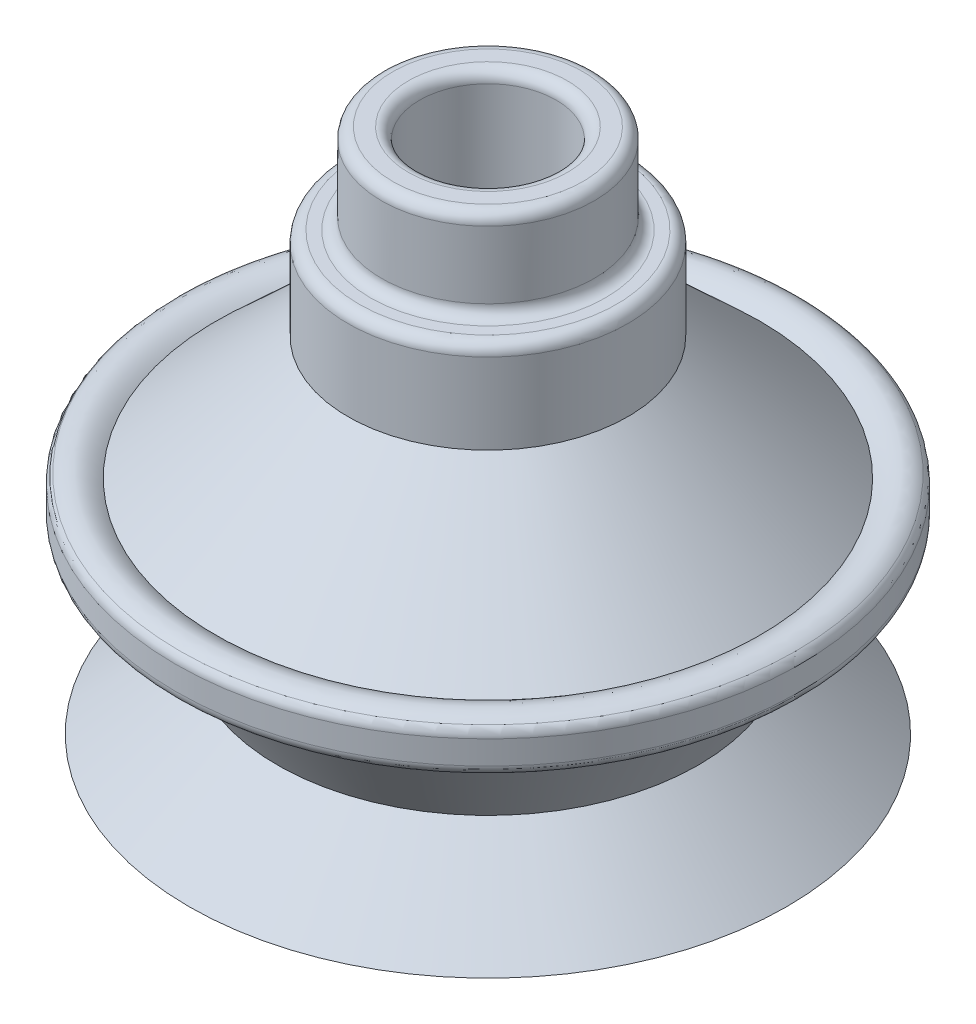
ISO-10303-21;
HEADER;
FILE_DESCRIPTION(('STEP AP214'),'2;1');
FILE_NAME('part.step','',(''),(''),'','','');
FILE_SCHEMA(('AUTOMOTIVE_DESIGN { 1 0 10303 214 1 1 1 1 }'));
ENDSEC;
DATA;
#1=APPLICATION_CONTEXT('core data for automotive mechanical design processes');
#2=APPLICATION_PROTOCOL_DEFINITION('international standard','automotive_design',2000,#1);
#3=PRODUCT_CONTEXT('',#1,'mechanical');
#4=PRODUCT('Part','Part','',(#3));
#5=PRODUCT_RELATED_PRODUCT_CATEGORY('part','',(#4));
#6=PRODUCT_DEFINITION_FORMATION('','',#4);
#7=PRODUCT_DEFINITION_CONTEXT('part definition',#1,'design');
#8=PRODUCT_DEFINITION('design','',#6,#7);
#9=PRODUCT_DEFINITION_SHAPE('','',#8);
#10=(LENGTH_UNIT() NAMED_UNIT(*) SI_UNIT(.MILLI.,.METRE.));
#11=(NAMED_UNIT(*) PLANE_ANGLE_UNIT() SI_UNIT($,.RADIAN.));
#12=(NAMED_UNIT(*) SI_UNIT($,.STERADIAN.) SOLID_ANGLE_UNIT());
#13=UNCERTAINTY_MEASURE_WITH_UNIT(LENGTH_MEASURE(1.E-05),#10,'distance_accuracy_value','');
#14=(GEOMETRIC_REPRESENTATION_CONTEXT(3) GLOBAL_UNCERTAINTY_ASSIGNED_CONTEXT((#13)) GLOBAL_UNIT_ASSIGNED_CONTEXT((#10,
#11,#12)) REPRESENTATION_CONTEXT('',''));
#15=CARTESIAN_POINT('',(0.,0.,0.));
#16=DIRECTION('',(0.,0.,1.));
#17=DIRECTION('',(1.,0.,0.));
#18=AXIS2_PLACEMENT_3D('',#15,#16,#17);
#19=CARTESIAN_POINT('',(11.15,-11.4805204985761,0.));
#20=DIRECTION('',(0.,1.,0.));
#21=DIRECTION('',(-1.,0.,0.));
#22=AXIS2_PLACEMENT_3D('',#19,#20,#21);
#23=PLANE('',#22);
#24=CARTESIAN_POINT('',(0.,-11.480520498576,0.));
#25=DIRECTION('',(0.,-1.,0.));
#26=DIRECTION('',(1.,0.,0.));
#27=AXIS2_PLACEMENT_3D('',#24,#25,#26);
#28=CIRCLE('',#27,11.15);
#29=CARTESIAN_POINT('',(11.15,-11.4805204985761,0.));
#30=VERTEX_POINT('',#29);
#31=EDGE_CURVE('E58',#30,#30,#28,.T.);
#32=ORIENTED_EDGE('',*,*,#31,.T.);
#33=EDGE_LOOP('',(#32));
#34=FACE_BOUND('',#33,.T.);
#35=CARTESIAN_POINT('',(0.,-11.480520498576,0.));
#36=DIRECTION('',(0.,-1.,0.));
#37=DIRECTION('',(1.,0.,0.));
#38=AXIS2_PLACEMENT_3D('',#35,#36,#37);
#39=CIRCLE('',#38,12.2427575);
#40=CARTESIAN_POINT('',(12.2427575,-11.4805204985761,0.));
#41=VERTEX_POINT('',#40);
#42=EDGE_CURVE('E11',#41,#41,#39,.T.);
#43=ORIENTED_EDGE('',*,*,#42,.F.);
#44=EDGE_LOOP('',(#43));
#45=FACE_BOUND('',#44,.T.);
#46=ADVANCED_FACE('F48',(#34,#45),#23,.T.);
#47=CARTESIAN_POINT('',(0.,-16.,0.));
#48=DIRECTION('',(0.,1.,0.));
#49=DIRECTION('',(-1.,0.,0.));
#50=AXIS2_PLACEMENT_3D('',#47,#48,#49);
#51=CONICAL_SURFACE('',#50,9.40000000000002,0.561471325993004);
#52=ORIENTED_EDGE('',*,*,#42,.T.);
#53=EDGE_LOOP('',(#52));
#54=FACE_BOUND('',#53,.T.);
#55=CARTESIAN_POINT('',(0.,-16.,0.));
#56=DIRECTION('',(0.,-1.,0.));
#57=DIRECTION('',(1.,0.,0.));
#58=AXIS2_PLACEMENT_3D('',#55,#56,#57);
#59=CIRCLE('',#58,9.40000000000002);
#60=CARTESIAN_POINT('',(9.4,-16.,0.));
#61=VERTEX_POINT('',#60);
#62=EDGE_CURVE('E54',#61,#61,#59,.T.);
#63=ORIENTED_EDGE('',*,*,#62,.F.);
#64=EDGE_LOOP('',(#63));
#65=FACE_BOUND('',#64,.T.);
#66=ADVANCED_FACE('F91',(#54,#65),#51,.T.);
#67=CARTESIAN_POINT('',(0.,-11.480520498576,0.));
#68=DIRECTION('',(0.,1.,0.));
#69=DIRECTION('',(-1.,0.,0.));
#70=AXIS2_PLACEMENT_3D('',#67,#68,#69);
#71=CONICAL_SURFACE('',#70,11.15,0.425837064198457);
#72=CARTESIAN_POINT('',(0.,-16.,0.));
#73=DIRECTION('',(0.,1.,0.));
#74=DIRECTION('',(0.,0.,1.));
#75=AXIS2_PLACEMENT_3D('',#72,#73,#74);
#76=CIRCLE('',#75,9.1);
#77=CARTESIAN_POINT('',(0.,-16.,9.1));
#78=VERTEX_POINT('',#77);
#79=EDGE_CURVE('E62',#78,#78,#76,.T.);
#80=ORIENTED_EDGE('',*,*,#79,.F.);
#81=EDGE_LOOP('',(#80));
#82=FACE_BOUND('',#81,.T.);
#83=ORIENTED_EDGE('',*,*,#31,.F.);
#84=EDGE_LOOP('',(#83));
#85=FACE_BOUND('',#84,.T.);
#86=ADVANCED_FACE('F85',(#82,#85),#71,.F.);
#87=CARTESIAN_POINT('',(0.,-16.,0.));
#88=DIRECTION('',(0.,-1.,0.));
#89=DIRECTION('',(0.,0.,-1.));
#90=AXIS2_PLACEMENT_3D('',#87,#88,#89);
#91=CONICAL_SURFACE('',#90,9.1,0.806374107431471);
#92=CARTESIAN_POINT('',(0.,-19.5,0.));
#93=DIRECTION('',(0.,1.,0.));
#94=DIRECTION('',(0.,0.,1.));
#95=AXIS2_PLACEMENT_3D('',#92,#93,#94);
#96=CIRCLE('',#95,12.75);
#97=CARTESIAN_POINT('',(0.,-19.5,12.75));
#98=VERTEX_POINT('',#97);
#99=EDGE_CURVE('E67',#98,#98,#96,.T.);
#100=ORIENTED_EDGE('',*,*,#99,.F.);
#101=EDGE_LOOP('',(#100));
#102=FACE_BOUND('',#101,.T.);
#103=ORIENTED_EDGE('',*,*,#79,.T.);
#104=EDGE_LOOP('',(#103));
#105=FACE_BOUND('',#104,.T.);
#106=ADVANCED_FACE('F79',(#102,#105),#91,.F.);
#107=CARTESIAN_POINT('',(12.75,-19.5,0.));
#108=DIRECTION('',(0.,1.,0.));
#109=DIRECTION('',(0.,0.,1.));
#110=AXIS2_PLACEMENT_3D('',#107,#108,#109);
#111=PLANE('',#110);
#112=CARTESIAN_POINT('',(0.,-19.5,0.));
#113=DIRECTION('',(0.,1.,0.));
#114=DIRECTION('',(0.,0.,1.));
#115=AXIS2_PLACEMENT_3D('',#112,#113,#114);
#116=CIRCLE('',#115,13.35);
#117=CARTESIAN_POINT('',(0.,-19.5,13.35));
#118=VERTEX_POINT('',#117);
#119=EDGE_CURVE('E70',#118,#118,#116,.T.);
#120=ORIENTED_EDGE('',*,*,#119,.F.);
#121=EDGE_LOOP('',(#120));
#122=FACE_BOUND('',#121,.T.);
#123=ORIENTED_EDGE('',*,*,#99,.T.);
#124=EDGE_LOOP('',(#123));
#125=FACE_BOUND('',#124,.T.);
#126=ADVANCED_FACE('F76',(#122,#125),#111,.F.);
#127=CARTESIAN_POINT('',(0.,-19.5,0.));
#128=DIRECTION('',(0.,-1.,0.));
#129=DIRECTION('',(0.,0.,-1.));
#130=AXIS2_PLACEMENT_3D('',#127,#128,#129);
#131=CONICAL_SURFACE('',#130,13.35,0.845727548937141);
#132=ORIENTED_EDGE('',*,*,#62,.T.);
#133=EDGE_LOOP('',(#132));
#134=FACE_BOUND('',#133,.T.);
#135=ORIENTED_EDGE('',*,*,#119,.T.);
#136=EDGE_LOOP('',(#135));
#137=FACE_BOUND('',#136,.T.);
#138=ADVANCED_FACE('F74',(#134,#137),#131,.T.);
#139=CLOSED_SHELL('',(#46,#66,#86,#106,#126,#138));
#140=MANIFOLD_SOLID_BREP('B2',#139);
#141=CARTESIAN_POINT('',(0.,4.,0.));
#142=DIRECTION('',(0.,1.,0.));
#143=DIRECTION('',(0.,0.,1.));
#144=AXIS2_PLACEMENT_3D('',#141,#142,#143);
#145=PLANE('',#144);
#146=CARTESIAN_POINT('',(0.,4.,0.));
#147=DIRECTION('',(0.,1.,0.));
#148=DIRECTION('',(0.,0.,1.));
#149=AXIS2_PLACEMENT_3D('',#146,#147,#148);
#150=CIRCLE('',#149,3.55);
#151=CARTESIAN_POINT('',(0.,4.,3.55));
#152=VERTEX_POINT('',#151);
#153=EDGE_CURVE('E175',#152,#152,#150,.F.);
#154=ORIENTED_EDGE('',*,*,#153,.T.);
#155=EDGE_LOOP('',(#154));
#156=FACE_BOUND('',#155,.T.);
#157=CARTESIAN_POINT('',(0.,4.,0.));
#158=DIRECTION('',(0.,1.,0.));
#159=DIRECTION('',(0.,0.,1.));
#160=AXIS2_PLACEMENT_3D('',#157,#158,#159);
#161=CIRCLE('',#160,4.25);
#162=CARTESIAN_POINT('',(0.,4.,4.25));
#163=VERTEX_POINT('',#162);
#164=EDGE_CURVE('E179',#163,#163,#161,.T.);
#165=ORIENTED_EDGE('',*,*,#164,.T.);
#166=EDGE_LOOP('',(#165));
#167=FACE_BOUND('',#166,.T.);
#168=ADVANCED_FACE('F151',(#156,#167),#145,.T.);
#169=CARTESIAN_POINT('',(0.,4.,0.));
#170=DIRECTION('',(0.,-1.,0.));
#171=DIRECTION('',(0.,0.,-1.));
#172=AXIS2_PLACEMENT_3D('',#169,#170,#171);
#173=CYLINDRICAL_SURFACE('',#172,4.75);
#174=CARTESIAN_POINT('',(0.,0.5,0.));
#175=DIRECTION('',(0.,-1.,0.));
#176=DIRECTION('',(0.,0.,-1.));
#177=AXIS2_PLACEMENT_3D('',#174,#175,#176);
#178=CIRCLE('',#177,4.75);
#179=CARTESIAN_POINT('',(0.,0.5,-4.75));
#180=VERTEX_POINT('',#179);
#181=EDGE_CURVE('E187',#180,#180,#178,.F.);
#182=ORIENTED_EDGE('',*,*,#181,.T.);
#183=EDGE_LOOP('',(#182));
#184=FACE_BOUND('',#183,.T.);
#185=CARTESIAN_POINT('',(0.,3.5,0.));
#186=DIRECTION('',(0.,1.,0.));
#187=DIRECTION('',(0.,0.,1.));
#188=AXIS2_PLACEMENT_3D('',#185,#186,#187);
#189=CIRCLE('',#188,4.75);
#190=CARTESIAN_POINT('',(0.,3.5,4.75));
#191=VERTEX_POINT('',#190);
#192=EDGE_CURVE('E191',#191,#191,#189,.F.);
#193=ORIENTED_EDGE('',*,*,#192,.T.);
#194=EDGE_LOOP('',(#193));
#195=FACE_BOUND('',#194,.T.);
#196=ADVANCED_FACE('F280',(#184,#195),#173,.T.);
#197=CARTESIAN_POINT('',(0.,4.,0.));
#198=DIRECTION('',(0.,-1.,0.));
#199=DIRECTION('',(0.,0.,-1.));
#200=AXIS2_PLACEMENT_3D('',#197,#198,#199);
#201=CYLINDRICAL_SURFACE('',#200,3.05);
#202=CARTESIAN_POINT('',(0.,3.5,0.));
#203=DIRECTION('',(0.,1.,0.));
#204=DIRECTION('',(0.,0.,1.));
#205=AXIS2_PLACEMENT_3D('',#202,#203,#204);
#206=CIRCLE('',#205,3.05);
#207=CARTESIAN_POINT('',(0.,3.5,3.05));
#208=VERTEX_POINT('',#207);
#209=EDGE_CURVE('E183',#208,#208,#206,.T.);
#210=ORIENTED_EDGE('',*,*,#209,.T.);
#211=EDGE_LOOP('',(#210));
#212=FACE_BOUND('',#211,.T.);
#213=CARTESIAN_POINT('',(0.,-4.1,0.));
#214=DIRECTION('',(0.,-1.,0.));
#215=DIRECTION('',(0.,0.,-1.));
#216=AXIS2_PLACEMENT_3D('',#213,#214,#215);
#217=CIRCLE('',#216,3.05);
#218=CARTESIAN_POINT('',(0.,-4.1,-3.05));
#219=VERTEX_POINT('',#218);
#220=EDGE_CURVE('E215',#219,#219,#217,.T.);
#221=ORIENTED_EDGE('',*,*,#220,.T.);
#222=EDGE_LOOP('',(#221));
#223=FACE_BOUND('',#222,.T.);
#224=ADVANCED_FACE('F273',(#212,#223),#201,.F.);
#225=CARTESIAN_POINT('',(0.,0.,0.));
#226=DIRECTION('',(0.,-1.,0.));
#227=DIRECTION('',(0.,0.,-1.));
#228=AXIS2_PLACEMENT_3D('',#225,#226,#227);
#229=PLANE('',#228);
#230=CARTESIAN_POINT('',(0.,0.,0.));
#231=DIRECTION('',(0.,-1.,0.));
#232=DIRECTION('',(0.,0.,-1.));
#233=AXIS2_PLACEMENT_3D('',#230,#231,#232);
#234=CIRCLE('',#233,5.75);
#235=CARTESIAN_POINT('',(0.,0.,-5.75));
#236=VERTEX_POINT('',#235);
#237=EDGE_CURVE('E195',#236,#236,#234,.F.);
#238=ORIENTED_EDGE('',*,*,#237,.T.);
#239=EDGE_LOOP('',(#238));
#240=FACE_BOUND('',#239,.T.);
#241=CARTESIAN_POINT('',(0.,0.,0.));
#242=DIRECTION('',(0.,-1.,0.));
#243=DIRECTION('',(0.,0.,-1.));
#244=AXIS2_PLACEMENT_3D('',#241,#242,#243);
#245=CIRCLE('',#244,5.25);
#246=CARTESIAN_POINT('',(0.,0.,-5.25));
#247=VERTEX_POINT('',#246);
#248=EDGE_CURVE('E199',#247,#247,#245,.T.);
#249=ORIENTED_EDGE('',*,*,#248,.T.);
#250=EDGE_LOOP('',(#249));
#251=FACE_BOUND('',#250,.T.);
#252=ADVANCED_FACE('F270',(#240,#251),#229,.F.);
#253=CARTESIAN_POINT('',(0.,-4.1,0.));
#254=DIRECTION('',(0.,1.,0.));
#255=DIRECTION('',(0.,0.,1.));
#256=AXIS2_PLACEMENT_3D('',#253,#254,#255);
#257=CYLINDRICAL_SURFACE('',#256,6.25);
#258=CARTESIAN_POINT('',(0.,-0.5,0.));
#259=DIRECTION('',(0.,-1.,0.));
#260=DIRECTION('',(0.,0.,-1.));
#261=AXIS2_PLACEMENT_3D('',#258,#259,#260);
#262=CIRCLE('',#261,6.25);
#263=CARTESIAN_POINT('',(0.,-0.5,-6.25));
#264=VERTEX_POINT('',#263);
#265=EDGE_CURVE('E203',#264,#264,#262,.T.);
#266=ORIENTED_EDGE('',*,*,#265,.T.);
#267=EDGE_LOOP('',(#266));
#268=FACE_BOUND('',#267,.T.);
#269=CARTESIAN_POINT('',(0.,-4.1,0.));
#270=DIRECTION('',(0.,-1.,0.));
#271=DIRECTION('',(0.,0.,-1.));
#272=AXIS2_PLACEMENT_3D('',#269,#270,#271);
#273=CIRCLE('',#272,6.25);
#274=CARTESIAN_POINT('',(0.,-4.1,-6.25));
#275=VERTEX_POINT('',#274);
#276=EDGE_CURVE('E207',#275,#275,#273,.T.);
#277=ORIENTED_EDGE('',*,*,#276,.F.);
#278=EDGE_LOOP('',(#277));
#279=FACE_BOUND('',#278,.T.);
#280=ADVANCED_FACE('F268',(#268,#279),#257,.T.);
#281=CARTESIAN_POINT('',(0.,-9.6,0.));
#282=DIRECTION('',(0.,-1.,0.));
#283=DIRECTION('',(0.,0.,-1.));
#284=AXIS2_PLACEMENT_3D('',#281,#282,#283);
#285=CONICAL_SURFACE('',#284,12.15,0.820471493930674);
#286=ORIENTED_EDGE('',*,*,#276,.T.);
#287=EDGE_LOOP('',(#286));
#288=FACE_BOUND('',#287,.T.);
#289=CARTESIAN_POINT('',(0.,-9.6,0.));
#290=DIRECTION('',(0.,-1.,0.));
#291=DIRECTION('',(0.,0.,-1.));
#292=AXIS2_PLACEMENT_3D('',#289,#290,#291);
#293=CIRCLE('',#292,12.15);
#294=CARTESIAN_POINT('',(0.,-9.6,-12.15));
#295=VERTEX_POINT('',#294);
#296=EDGE_CURVE('E211',#295,#295,#293,.T.);
#297=ORIENTED_EDGE('',*,*,#296,.F.);
#298=EDGE_LOOP('',(#297));
#299=FACE_BOUND('',#298,.T.);
#300=ADVANCED_FACE('F264',(#288,#299),#285,.T.);
#301=CARTESIAN_POINT('',(0.,-4.1,0.));
#302=DIRECTION('',(0.,-1.,0.));
#303=DIRECTION('',(0.,0.,-1.));
#304=AXIS2_PLACEMENT_3D('',#301,#302,#303);
#305=CONICAL_SURFACE('',#304,3.05,0.974295344275071);
#306=CARTESIAN_POINT('',(0.,-9.6,0.));
#307=DIRECTION('',(0.,-1.,0.));
#308=DIRECTION('',(0.,0.,-1.));
#309=AXIS2_PLACEMENT_3D('',#306,#307,#308);
#310=CIRCLE('',#309,11.15);
#311=CARTESIAN_POINT('',(0.,-9.6,-11.15));
#312=VERTEX_POINT('',#311);
#313=EDGE_CURVE('E219',#312,#312,#310,.T.);
#314=CARTESIAN_POINT('',(0.,-9.6,-11.15));
#315=CARTESIAN_POINT('',(0.,-9.54270833333333,-11.065625));
#316=CARTESIAN_POINT('',(0.,-9.48541666666667,-10.98125));
#317=CARTESIAN_POINT('',(0.,-9.37083333333333,-10.8125));
#318=CARTESIAN_POINT('',(0.,-9.31354166666667,-10.728125));
#319=CARTESIAN_POINT('',(0.,-9.19895833333333,-10.559375));
#320=CARTESIAN_POINT('',(0.,-9.14166666666666,-10.475));
#321=CARTESIAN_POINT('',(0.,-9.02708333333333,-10.30625));
#322=CARTESIAN_POINT('',(0.,-8.96979166666667,-10.221875));
#323=CARTESIAN_POINT('',(0.,-8.85520833333333,-10.053125));
#324=CARTESIAN_POINT('',(0.,-8.79791666666667,-9.96875));
#325=CARTESIAN_POINT('',(0.,-8.68333333333333,-9.8));
#326=CARTESIAN_POINT('',(0.,-8.62604166666667,-9.715625));
#327=CARTESIAN_POINT('',(0.,-8.51145833333333,-9.546875));
#328=CARTESIAN_POINT('',(0.,-8.45416666666667,-9.4625));
#329=CARTESIAN_POINT('',(0.,-8.33958333333333,-9.29375));
#330=CARTESIAN_POINT('',(0.,-8.28229166666667,-9.209375));
#331=CARTESIAN_POINT('',(0.,-8.16770833333333,-9.040625));
#332=CARTESIAN_POINT('',(0.,-8.11041666666667,-8.95625));
#333=CARTESIAN_POINT('',(0.,-7.99583333333333,-8.7875));
#334=CARTESIAN_POINT('',(0.,-7.93854166666667,-8.703125));
#335=CARTESIAN_POINT('',(0.,-7.82395833333333,-8.534375));
#336=CARTESIAN_POINT('',(0.,-7.76666666666667,-8.45));
#337=CARTESIAN_POINT('',(0.,-7.65208333333333,-8.28125));
#338=CARTESIAN_POINT('',(0.,-7.59479166666667,-8.196875));
#339=CARTESIAN_POINT('',(0.,-7.48020833333333,-8.028125));
#340=CARTESIAN_POINT('',(0.,-7.42291666666667,-7.94375));
#341=CARTESIAN_POINT('',(0.,-7.30833333333333,-7.775));
#342=CARTESIAN_POINT('',(0.,-7.25104166666666,-7.690625));
#343=CARTESIAN_POINT('',(0.,-7.13645833333333,-7.521875));
#344=CARTESIAN_POINT('',(0.,-7.07916666666666,-7.4375));
#345=CARTESIAN_POINT('',(0.,-6.96458333333333,-7.26875));
#346=CARTESIAN_POINT('',(0.,-6.90729166666666,-7.184375));
#347=CARTESIAN_POINT('',(0.,-6.79270833333333,-7.015625));
#348=CARTESIAN_POINT('',(0.,-6.73541666666666,-6.93125));
#349=CARTESIAN_POINT('',(0.,-6.62083333333333,-6.7625));
#350=CARTESIAN_POINT('',(0.,-6.56354166666667,-6.678125));
#351=CARTESIAN_POINT('',(0.,-6.44895833333333,-6.509375));
#352=CARTESIAN_POINT('',(0.,-6.39166666666667,-6.425));
#353=CARTESIAN_POINT('',(0.,-6.27708333333333,-6.25625));
#354=CARTESIAN_POINT('',(0.,-6.21979166666666,-6.171875));
#355=CARTESIAN_POINT('',(0.,-6.10520833333333,-6.003125));
#356=CARTESIAN_POINT('',(0.,-6.04791666666667,-5.91875));
#357=CARTESIAN_POINT('',(0.,-5.93333333333333,-5.75));
#358=CARTESIAN_POINT('',(0.,-5.87604166666667,-5.665625));
#359=CARTESIAN_POINT('',(0.,-5.76145833333333,-5.496875));
#360=CARTESIAN_POINT('',(0.,-5.70416666666667,-5.4125));
#361=CARTESIAN_POINT('',(0.,-5.58958333333333,-5.24375));
#362=CARTESIAN_POINT('',(0.,-5.53229166666667,-5.159375));
#363=CARTESIAN_POINT('',(0.,-5.41770833333333,-4.990625));
#364=CARTESIAN_POINT('',(0.,-5.36041666666666,-4.90625));
#365=CARTESIAN_POINT('',(0.,-5.24583333333333,-4.7375));
#366=CARTESIAN_POINT('',(0.,-5.18854166666666,-4.653125));
#367=CARTESIAN_POINT('',(0.,-5.07395833333333,-4.484375));
#368=CARTESIAN_POINT('',(0.,-5.01666666666666,-4.4));
#369=CARTESIAN_POINT('',(0.,-4.90208333333333,-4.23125));
#370=CARTESIAN_POINT('',(0.,-4.84479166666666,-4.146875));
#371=CARTESIAN_POINT('',(0.,-4.73020833333333,-3.978125));
#372=CARTESIAN_POINT('',(0.,-4.67291666666667,-3.89375));
#373=CARTESIAN_POINT('',(0.,-4.55833333333333,-3.725));
#374=CARTESIAN_POINT('',(0.,-4.50104166666667,-3.640625));
#375=CARTESIAN_POINT('',(0.,-4.38645833333333,-3.471875));
#376=CARTESIAN_POINT('',(0.,-4.32916666666666,-3.3875));
#377=CARTESIAN_POINT('',(0.,-4.21458333333333,-3.21875));
#378=CARTESIAN_POINT('',(0.,-4.15729166666666,-3.134375));
#379=CARTESIAN_POINT('',(0.,-4.1,-3.05));
#380=B_SPLINE_CURVE_WITH_KNOTS('',3,(#314,#315,#316,#317,#318,#319,#320,#321,#322,#323,#324,
#325,#326,#327,#328,#329,#330,#331,#332,#333,#334,#335,#336,#337,#338,#339,#340,#341,#342,#343,
#344,#345,#346,#347,#348,#349,#350,#351,#352,#353,#354,#355,#356,#357,#358,#359,#360,#361,#362,
#363,#364,#365,#366,#367,#368,#369,#370,#371,#372,#373,#374,#375,#376,#377,#378,#379),
.UNSPECIFIED.,.F.,.F.,(4,2,2,2,2,2,2,2,2,2,2,2,2,2,2,2,2,2,2,2,2,2,2,2,2,2,2,2,2,2,2,2,4),(0.,
0.305962875607483,0.611925751214966,0.917888626822448,1.22385150242993,1.52981437803741,
1.8357772536449,2.14174012925238,2.44770300485986,2.75366588046734,3.05962875607483,
3.36559163168231,3.67155450728979,3.97751738289728,4.28348025850476,4.58944313411224,
4.89540600971973,5.20136888532721,5.50733176093469,5.81329463654217,6.11925751214966,
6.42522038775714,6.73118326336462,7.03714613897211,7.34310901457959,7.64907189018707,
7.95503476579456,8.26099764140204,8.56696051700952,8.872923392617,9.17888626822449,
9.48484914383197,9.79081201943946),.UNSPECIFIED.);
#381=EDGE_CURVE('BSEAM260',#312,#219,#380,.T.);
#382=ORIENTED_EDGE('',*,*,#313,.T.);
#383=ORIENTED_EDGE('',*,*,#220,.F.);
#384=ORIENTED_EDGE('',*,*,#381,.T.);
#385=ORIENTED_EDGE('',*,*,#381,.F.);
#386=EDGE_LOOP('',(#382,#384,#383,#385));
#387=FACE_BOUND('',#386,.T.);
#388=ADVANCED_FACE('F260',(#387),#305,.F.);
#389=CARTESIAN_POINT('',(0.,-9.6,0.));
#390=DIRECTION('',(0.,-1.,0.));
#391=DIRECTION('',(0.,0.,-1.));
#392=AXIS2_PLACEMENT_3D('',#389,#390,#391);
#393=CYLINDRICAL_SURFACE('',#392,11.15);
#394=CARTESIAN_POINT('',(0.,-11.1,0.));
#395=DIRECTION('',(0.,-1.,0.));
#396=DIRECTION('',(0.,0.,-1.));
#397=AXIS2_PLACEMENT_3D('',#394,#395,#396);
#398=CIRCLE('',#397,11.15);
#399=CARTESIAN_POINT('',(0.,-11.1,-11.15));
#400=VERTEX_POINT('',#399);
#401=EDGE_CURVE('E223',#400,#400,#398,.T.);
#402=ORIENTED_EDGE('',*,*,#401,.T.);
#403=EDGE_LOOP('',(#402));
#404=FACE_BOUND('',#403,.T.);
#405=ORIENTED_EDGE('',*,*,#313,.F.);
#406=EDGE_LOOP('',(#405));
#407=FACE_BOUND('',#406,.T.);
#408=ADVANCED_FACE('F256',(#404,#407),#393,.F.);
#409=CARTESIAN_POINT('',(11.15,-11.1,0.));
#410=DIRECTION('',(0.,-1.,0.));
#411=DIRECTION('',(0.,0.,-1.));
#412=AXIS2_PLACEMENT_3D('',#409,#410,#411);
#413=PLANE('',#412);
#414=CARTESIAN_POINT('',(0.,-11.1,0.));
#415=DIRECTION('',(0.,-1.,0.));
#416=DIRECTION('',(0.,0.,-1.));
#417=AXIS2_PLACEMENT_3D('',#414,#415,#416);
#418=CIRCLE('',#417,12.2427576742754);
#419=CARTESIAN_POINT('',(0.,-11.1,-12.2427576742754));
#420=VERTEX_POINT('',#419);
#421=EDGE_CURVE('E227',#420,#420,#418,.T.);
#422=ORIENTED_EDGE('',*,*,#421,.T.);
#423=EDGE_LOOP('',(#422));
#424=FACE_BOUND('',#423,.T.);
#425=ORIENTED_EDGE('',*,*,#401,.F.);
#426=EDGE_LOOP('',(#425));
#427=FACE_BOUND('',#426,.T.);
#428=ADVANCED_FACE('F253',(#424,#427),#413,.T.);
#429=CARTESIAN_POINT('',(12.2427576742754,-11.1,0.));
#430=CARTESIAN_POINT('',(13.2139938096278,-11.8610409971522,0.));
#431=CARTESIAN_POINT('',(13.95,-11.1,0.));
#432=B_SPLINE_CURVE_WITH_KNOTS('',2,(#429,#430,#431),.UNSPECIFIED.,.F.,.F.,(3,3),(0.,1.),.UNSPECIFIED.);
#433=CARTESIAN_POINT('',(0.,-9.6,0.));
#434=DIRECTION('',(0.,-1.,0.));
#435=AXIS1_PLACEMENT('',#433,#434);
#436=SURFACE_OF_REVOLUTION('',#432,#435);
#437=CARTESIAN_POINT('',(0.,-11.2822622440687,0.));
#438=DIRECTION('',(0.,-1.,0.));
#439=DIRECTION('',(0.,0.,-1.));
#440=AXIS2_PLACEMENT_3D('',#437,#438,#439);
#441=CIRCLE('',#440,13.7407040934255);
#442=CARTESIAN_POINT('',(0.,-11.2822622440687,-13.7407040934255));
#443=VERTEX_POINT('',#442);
#444=EDGE_CURVE('E47',#443,#443,#441,.T.);
#445=ORIENTED_EDGE('',*,*,#444,.T.);
#446=EDGE_LOOP('',(#445));
#447=FACE_BOUND('',#446,.T.);
#448=ORIENTED_EDGE('',*,*,#421,.F.);
#449=EDGE_LOOP('',(#448));
#450=FACE_BOUND('',#449,.T.);
#451=ADVANCED_FACE('F249',(#447,#450),#436,.F.);
#452=CARTESIAN_POINT('',(0.,-9.6,0.));
#453=DIRECTION('',(0.,-1.,0.));
#454=DIRECTION('',(0.,0.,-1.));
#455=AXIS2_PLACEMENT_3D('',#452,#453,#454);
#456=CYLINDRICAL_SURFACE('',#455,13.95);
#457=CARTESIAN_POINT('',(0.,-9.82341284021527,0.));
#458=DIRECTION('',(0.,1.,0.));
#459=DIRECTION('',(0.,0.,1.));
#460=AXIS2_PLACEMENT_3D('',#457,#458,#459);
#461=CIRCLE('',#460,13.95);
#462=CARTESIAN_POINT('',(0.,-9.82341284021527,13.95));
#463=VERTEX_POINT('',#462);
#464=EDGE_CURVE('E164',#463,#463,#461,.F.);
#465=ORIENTED_EDGE('',*,*,#464,.T.);
#466=EDGE_LOOP('',(#465));
#467=FACE_BOUND('',#466,.T.);
#468=CARTESIAN_POINT('',(0.,-10.8754562337091,0.));
#469=DIRECTION('',(0.,1.,0.));
#470=DIRECTION('',(0.,0.,1.));
#471=AXIS2_PLACEMENT_3D('',#468,#469,#470);
#472=CIRCLE('',#471,13.95);
#473=CARTESIAN_POINT('',(0.,-10.8754562337091,13.95));
#474=VERTEX_POINT('',#473);
#475=EDGE_CURVE('E169',#474,#474,#472,.T.);
#476=ORIENTED_EDGE('',*,*,#475,.T.);
#477=EDGE_LOOP('',(#476));
#478=FACE_BOUND('',#477,.T.);
#479=ADVANCED_FACE('F246',(#467,#478),#456,.T.);
#480=CARTESIAN_POINT('',(13.95,-9.6,0.));
#481=CARTESIAN_POINT('',(13.1821497918157,-8.80585432058719,0.));
#482=CARTESIAN_POINT('',(12.15,-9.6,0.));
#483=B_SPLINE_CURVE_WITH_KNOTS('',2,(#480,#481,#482),.UNSPECIFIED.,.F.,.F.,(3,3),(0.,1.),.UNSPECIFIED.);
#484=CARTESIAN_POINT('',(0.,-9.6,0.));
#485=DIRECTION('',(0.,-1.,0.));
#486=AXIS1_PLACEMENT('',#484,#485);
#487=SURFACE_OF_REVOLUTION('',#483,#486);
#488=CARTESIAN_POINT('',(0.,-9.41988933204506,0.));
#489=DIRECTION('',(0.,-1.,0.));
#490=DIRECTION('',(0.,0.,-1.));
#491=AXIS2_PLACEMENT_3D('',#488,#489,#490);
#492=CIRCLE('',#491,13.7452435915541);
#493=CARTESIAN_POINT('',(0.,-9.41988933204506,-13.7452435915541));
#494=VERTEX_POINT('',#493);
#495=EDGE_CURVE('E159',#494,#494,#492,.F.);
#496=ORIENTED_EDGE('',*,*,#495,.T.);
#497=EDGE_LOOP('',(#496));
#498=FACE_BOUND('',#497,.T.);
#499=ORIENTED_EDGE('',*,*,#296,.T.);
#500=EDGE_LOOP('',(#499));
#501=FACE_BOUND('',#500,.T.);
#502=ADVANCED_FACE('F242',(#498,#501),#487,.F.);
#503=CARTESIAN_POINT('',(0.,-0.5,0.));
#504=DIRECTION('',(0.,-1.,0.));
#505=DIRECTION('',(0.,0.,-1.));
#506=AXIS2_PLACEMENT_3D('',#503,#504,#505);
#507=TOROIDAL_SURFACE('',#506,5.75,0.5);
#508=ORIENTED_EDGE('',*,*,#237,.F.);
#509=EDGE_LOOP('',(#508));
#510=FACE_BOUND('',#509,.T.);
#511=ORIENTED_EDGE('',*,*,#265,.F.);
#512=EDGE_LOOP('',(#511));
#513=FACE_BOUND('',#512,.T.);
#514=ADVANCED_FACE('F245',(#510,#513),#507,.T.);
#515=CARTESIAN_POINT('',(0.,0.5,0.));
#516=DIRECTION('',(0.,-1.,0.));
#517=DIRECTION('',(0.,0.,-1.));
#518=AXIS2_PLACEMENT_3D('',#515,#516,#517);
#519=TOROIDAL_SURFACE('',#518,5.25,0.5);
#520=ORIENTED_EDGE('',*,*,#248,.F.);
#521=EDGE_LOOP('',(#520));
#522=FACE_BOUND('',#521,.T.);
#523=ORIENTED_EDGE('',*,*,#181,.F.);
#524=EDGE_LOOP('',(#523));
#525=FACE_BOUND('',#524,.T.);
#526=ADVANCED_FACE('F290',(#522,#525),#519,.F.);
#527=CARTESIAN_POINT('',(0.,3.5,0.));
#528=DIRECTION('',(0.,1.,0.));
#529=DIRECTION('',(0.,0.,1.));
#530=AXIS2_PLACEMENT_3D('',#527,#528,#529);
#531=TOROIDAL_SURFACE('',#530,3.55,0.5);
#532=ORIENTED_EDGE('',*,*,#153,.F.);
#533=EDGE_LOOP('',(#532));
#534=FACE_BOUND('',#533,.T.);
#535=ORIENTED_EDGE('',*,*,#209,.F.);
#536=EDGE_LOOP('',(#535));
#537=FACE_BOUND('',#536,.T.);
#538=ADVANCED_FACE('F294',(#534,#537),#531,.T.);
#539=CARTESIAN_POINT('',(0.,3.5,0.));
#540=DIRECTION('',(0.,1.,0.));
#541=DIRECTION('',(0.,0.,1.));
#542=AXIS2_PLACEMENT_3D('',#539,#540,#541);
#543=TOROIDAL_SURFACE('',#542,4.25,0.5);
#544=ORIENTED_EDGE('',*,*,#192,.F.);
#545=EDGE_LOOP('',(#544));
#546=FACE_BOUND('',#545,.T.);
#547=ORIENTED_EDGE('',*,*,#164,.F.);
#548=EDGE_LOOP('',(#547));
#549=FACE_BOUND('',#548,.T.);
#550=ADVANCED_FACE('F298',(#546,#549),#543,.T.);
#551=CARTESIAN_POINT('',(0.,-9.82341284021527,0.));
#552=DIRECTION('',(0.,1.,0.));
#553=DIRECTION('',(0.,0.,1.));
#554=AXIS2_PLACEMENT_3D('',#551,#552,#553);
#555=TOROIDAL_SURFACE('',#554,13.4500000000002,0.5);
#556=ORIENTED_EDGE('',*,*,#495,.F.);
#557=EDGE_LOOP('',(#556));
#558=FACE_BOUND('',#557,.T.);
#559=ORIENTED_EDGE('',*,*,#464,.F.);
#560=EDGE_LOOP('',(#559));
#561=FACE_BOUND('',#560,.T.);
#562=ADVANCED_FACE('F301',(#558,#561),#555,.T.);
#563=CARTESIAN_POINT('',(0.,-10.8754562337091,0.));
#564=DIRECTION('',(0.,1.,0.));
#565=DIRECTION('',(0.,0.,1.));
#566=AXIS2_PLACEMENT_3D('',#563,#564,#565);
#567=TOROIDAL_SURFACE('',#566,13.4500000000009,0.5);
#568=ORIENTED_EDGE('',*,*,#475,.F.);
#569=EDGE_LOOP('',(#568));
#570=FACE_BOUND('',#569,.T.);
#571=ORIENTED_EDGE('',*,*,#444,.F.);
#572=EDGE_LOOP('',(#571));
#573=FACE_BOUND('',#572,.T.);
#574=ADVANCED_FACE('F153',(#570,#573),#567,.T.);
#575=CLOSED_SHELL('',(#168,#196,#224,#252,#280,#300,#388,#408,#428,#451,#479,#502,#514,#526,
#538,#550,#562,#574));
#576=MANIFOLD_SOLID_BREP('B6',#575);
#577=ADVANCED_BREP_SHAPE_REPRESENTATION('',(#18,#140,#576),#14);
#578=SHAPE_DEFINITION_REPRESENTATION(#9,#577);
ENDSEC;
END-ISO-10303-21;
